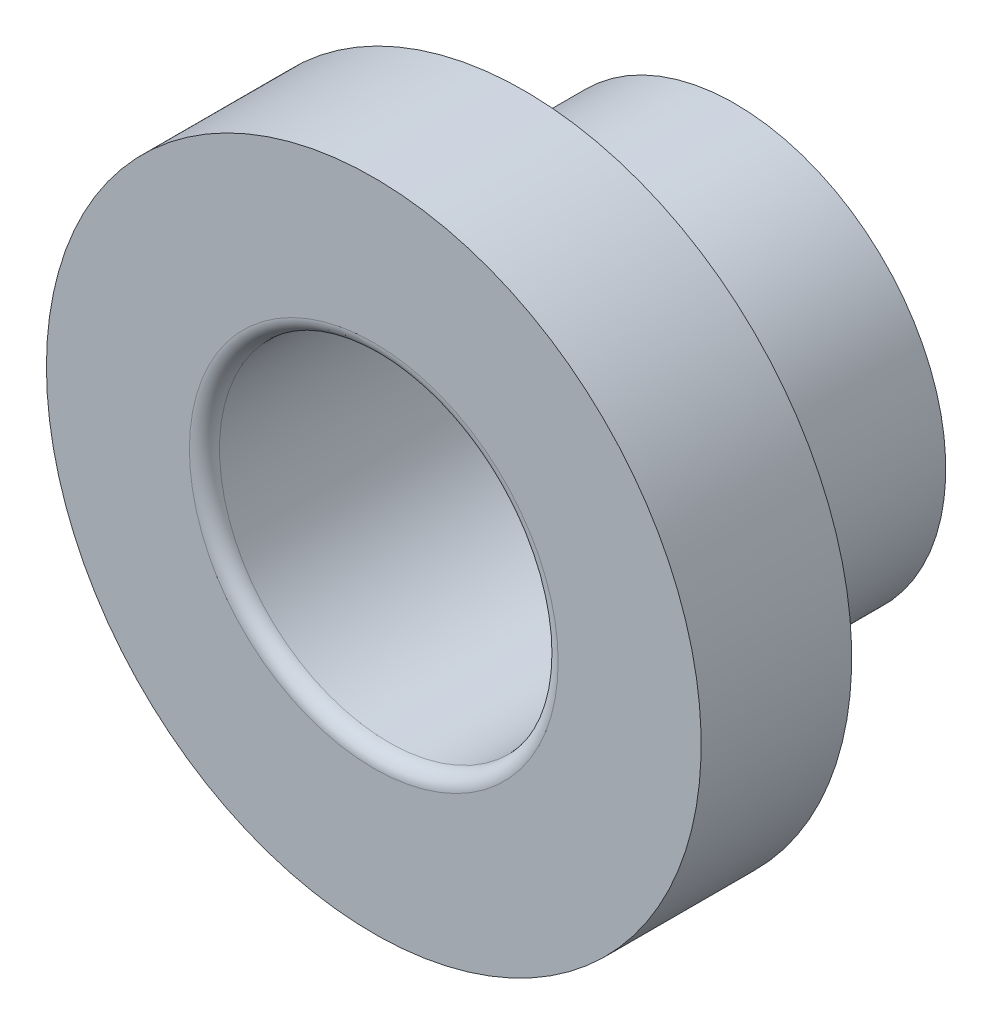
ISO-10303-21;
HEADER;
FILE_DESCRIPTION(('STEP AP214'),'2;1');
FILE_NAME('part.step','',(''),(''),'','','');
FILE_SCHEMA(('AUTOMOTIVE_DESIGN { 1 0 10303 214 1 1 1 1 }'));
ENDSEC;
DATA;
#1=APPLICATION_CONTEXT('core data for automotive mechanical design processes');
#2=APPLICATION_PROTOCOL_DEFINITION('international standard','automotive_design',2000,#1);
#3=PRODUCT_CONTEXT('',#1,'mechanical');
#4=PRODUCT('Part','Part','',(#3));
#5=PRODUCT_RELATED_PRODUCT_CATEGORY('part','',(#4));
#6=PRODUCT_DEFINITION_FORMATION('','',#4);
#7=PRODUCT_DEFINITION_CONTEXT('part definition',#1,'design');
#8=PRODUCT_DEFINITION('design','',#6,#7);
#9=PRODUCT_DEFINITION_SHAPE('','',#8);
#10=(LENGTH_UNIT() NAMED_UNIT(*) SI_UNIT(.MILLI.,.METRE.));
#11=(NAMED_UNIT(*) PLANE_ANGLE_UNIT() SI_UNIT($,.RADIAN.));
#12=(NAMED_UNIT(*) SI_UNIT($,.STERADIAN.) SOLID_ANGLE_UNIT());
#13=UNCERTAINTY_MEASURE_WITH_UNIT(LENGTH_MEASURE(1.E-05),#10,'distance_accuracy_value','');
#14=(GEOMETRIC_REPRESENTATION_CONTEXT(3) GLOBAL_UNCERTAINTY_ASSIGNED_CONTEXT((#13)) GLOBAL_UNIT_ASSIGNED_CONTEXT((#10,
#11,#12)) REPRESENTATION_CONTEXT('',''));
#15=CARTESIAN_POINT('',(0.,0.,0.));
#16=DIRECTION('',(0.,0.,1.));
#17=DIRECTION('',(1.,0.,0.));
#18=AXIS2_PLACEMENT_3D('',#15,#16,#17);
#19=CARTESIAN_POINT('',(0.,0.,0.));
#20=DIRECTION('',(0.,0.,-1.));
#21=DIRECTION('',(-1.,0.,0.));
#22=AXIS2_PLACEMENT_3D('',#19,#20,#21);
#23=PLANE('',#22);
#24=CARTESIAN_POINT('',(0.,0.,0.));
#25=DIRECTION('',(0.,0.,1.));
#26=DIRECTION('',(1.,0.,0.));
#27=AXIS2_PLACEMENT_3D('',#24,#25,#26);
#28=CIRCLE('',#27,1.12500000000001);
#29=CARTESIAN_POINT('',(1.12500000000001,0.,0.));
#30=VERTEX_POINT('',#29);
#31=EDGE_CURVE('E63',#30,#30,#28,.T.);
#32=ORIENTED_EDGE('',*,*,#31,.T.);
#33=EDGE_LOOP('',(#32));
#34=FACE_BOUND('',#33,.T.);
#35=CARTESIAN_POINT('',(0.,0.,0.));
#36=DIRECTION('',(0.,0.,-1.));
#37=DIRECTION('',(-1.,0.,0.));
#38=AXIS2_PLACEMENT_3D('',#35,#36,#37);
#39=CIRCLE('',#38,1.4);
#40=CARTESIAN_POINT('',(-1.4,0.,0.));
#41=VERTEX_POINT('',#40);
#42=EDGE_CURVE('E48',#41,#41,#39,.T.);
#43=ORIENTED_EDGE('',*,*,#42,.T.);
#44=EDGE_LOOP('',(#43));
#45=FACE_BOUND('',#44,.T.);
#46=ADVANCED_FACE('F37',(#34,#45),#23,.T.);
#47=CARTESIAN_POINT('',(0.,0.,2.4));
#48=DIRECTION('',(0.,0.,-1.));
#49=DIRECTION('',(-1.,0.,0.));
#50=AXIS2_PLACEMENT_3D('',#47,#48,#49);
#51=CYLINDRICAL_SURFACE('',#50,1.4);
#52=CARTESIAN_POINT('',(0.,0.,1.4));
#53=DIRECTION('',(0.,0.,-1.));
#54=DIRECTION('',(-1.,0.,0.));
#55=AXIS2_PLACEMENT_3D('',#52,#53,#54);
#56=CIRCLE('',#55,1.4);
#57=CARTESIAN_POINT('',(-1.4,0.,1.4));
#58=VERTEX_POINT('',#57);
#59=EDGE_CURVE('E52',#58,#58,#56,.T.);
#60=ORIENTED_EDGE('',*,*,#59,.T.);
#61=EDGE_LOOP('',(#60));
#62=FACE_BOUND('',#61,.T.);
#63=ORIENTED_EDGE('',*,*,#42,.F.);
#64=EDGE_LOOP('',(#63));
#65=FACE_BOUND('',#64,.T.);
#66=ADVANCED_FACE('F81',(#62,#65),#51,.T.);
#67=CARTESIAN_POINT('',(1.4,0.,1.4));
#68=DIRECTION('',(0.,0.,-1.));
#69=DIRECTION('',(-1.,0.,0.));
#70=AXIS2_PLACEMENT_3D('',#67,#68,#69);
#71=PLANE('',#70);
#72=CARTESIAN_POINT('',(0.,0.,1.4));
#73=DIRECTION('',(0.,0.,-1.));
#74=DIRECTION('',(-1.,0.,0.));
#75=AXIS2_PLACEMENT_3D('',#72,#73,#74);
#76=CIRCLE('',#75,2.175);
#77=CARTESIAN_POINT('',(-2.175,0.,1.4));
#78=VERTEX_POINT('',#77);
#79=EDGE_CURVE('E57',#78,#78,#76,.T.);
#80=ORIENTED_EDGE('',*,*,#79,.T.);
#81=EDGE_LOOP('',(#80));
#82=FACE_BOUND('',#81,.T.);
#83=ORIENTED_EDGE('',*,*,#59,.F.);
#84=EDGE_LOOP('',(#83));
#85=FACE_BOUND('',#84,.T.);
#86=ADVANCED_FACE('F86',(#82,#85),#71,.T.);
#87=CARTESIAN_POINT('',(0.,0.,2.4));
#88=DIRECTION('',(0.,0.,-1.));
#89=DIRECTION('',(-1.,0.,0.));
#90=AXIS2_PLACEMENT_3D('',#87,#88,#89);
#91=CYLINDRICAL_SURFACE('',#90,2.175);
#92=CARTESIAN_POINT('',(0.,0.,2.4));
#93=DIRECTION('',(0.,0.,-1.));
#94=DIRECTION('',(-1.,0.,0.));
#95=AXIS2_PLACEMENT_3D('',#92,#93,#94);
#96=CIRCLE('',#95,2.175);
#97=CARTESIAN_POINT('',(-2.175,0.,2.4));
#98=VERTEX_POINT('',#97);
#99=EDGE_CURVE('E60',#98,#98,#96,.T.);
#100=ORIENTED_EDGE('',*,*,#99,.T.);
#101=EDGE_LOOP('',(#100));
#102=FACE_BOUND('',#101,.T.);
#103=ORIENTED_EDGE('',*,*,#79,.F.);
#104=EDGE_LOOP('',(#103));
#105=FACE_BOUND('',#104,.T.);
#106=ADVANCED_FACE('F78',(#102,#105),#91,.T.);
#107=CARTESIAN_POINT('',(2.175,0.,2.4));
#108=DIRECTION('',(0.,0.,1.));
#109=DIRECTION('',(1.,0.,0.));
#110=AXIS2_PLACEMENT_3D('',#107,#108,#109);
#111=PLANE('',#110);
#112=CARTESIAN_POINT('',(0.,0.,2.4));
#113=DIRECTION('',(0.,0.,1.));
#114=DIRECTION('',(1.,0.,0.));
#115=AXIS2_PLACEMENT_3D('',#112,#113,#114);
#116=CIRCLE('',#115,1.22500000000001);
#117=CARTESIAN_POINT('',(1.22500000000001,0.,2.4));
#118=VERTEX_POINT('',#117);
#119=EDGE_CURVE('E10',#118,#118,#116,.F.);
#120=ORIENTED_EDGE('',*,*,#119,.T.);
#121=EDGE_LOOP('',(#120));
#122=FACE_BOUND('',#121,.T.);
#123=ORIENTED_EDGE('',*,*,#99,.F.);
#124=EDGE_LOOP('',(#123));
#125=FACE_BOUND('',#124,.T.);
#126=ADVANCED_FACE('F71',(#122,#125),#111,.T.);
#127=CARTESIAN_POINT('',(0.,0.,2.4));
#128=DIRECTION('',(0.,0.,1.));
#129=DIRECTION('',(1.,0.,0.));
#130=AXIS2_PLACEMENT_3D('',#127,#128,#129);
#131=CYLINDRICAL_SURFACE('',#130,1.12500000000001);
#132=CARTESIAN_POINT('',(0.,0.,2.3));
#133=DIRECTION('',(0.,0.,1.));
#134=DIRECTION('',(1.,0.,0.));
#135=AXIS2_PLACEMENT_3D('',#132,#133,#134);
#136=CIRCLE('',#135,1.12500000000001);
#137=CARTESIAN_POINT('',(1.12500000000001,0.,2.3));
#138=VERTEX_POINT('',#137);
#139=EDGE_CURVE('E44',#138,#138,#136,.T.);
#140=ORIENTED_EDGE('',*,*,#139,.T.);
#141=EDGE_LOOP('',(#140));
#142=FACE_BOUND('',#141,.T.);
#143=ORIENTED_EDGE('',*,*,#31,.F.);
#144=EDGE_LOOP('',(#143));
#145=FACE_BOUND('',#144,.T.);
#146=ADVANCED_FACE('F69',(#142,#145),#131,.F.);
#147=CARTESIAN_POINT('',(0.,0.,2.3));
#148=DIRECTION('',(0.,0.,1.));
#149=DIRECTION('',(1.,0.,0.));
#150=AXIS2_PLACEMENT_3D('',#147,#148,#149);
#151=TOROIDAL_SURFACE('',#150,1.22500000000001,0.1);
#152=ORIENTED_EDGE('',*,*,#119,.F.);
#153=EDGE_LOOP('',(#152));
#154=FACE_BOUND('',#153,.T.);
#155=ORIENTED_EDGE('',*,*,#139,.F.);
#156=EDGE_LOOP('',(#155));
#157=FACE_BOUND('',#156,.T.);
#158=ADVANCED_FACE('F39',(#154,#157),#151,.T.);
#159=CLOSED_SHELL('',(#46,#66,#86,#106,#126,#146,#158));
#160=MANIFOLD_SOLID_BREP('B2',#159);
#161=ADVANCED_BREP_SHAPE_REPRESENTATION('',(#18,#160),#14);
#162=SHAPE_DEFINITION_REPRESENTATION(#9,#161);
ENDSEC;
END-ISO-10303-21;
